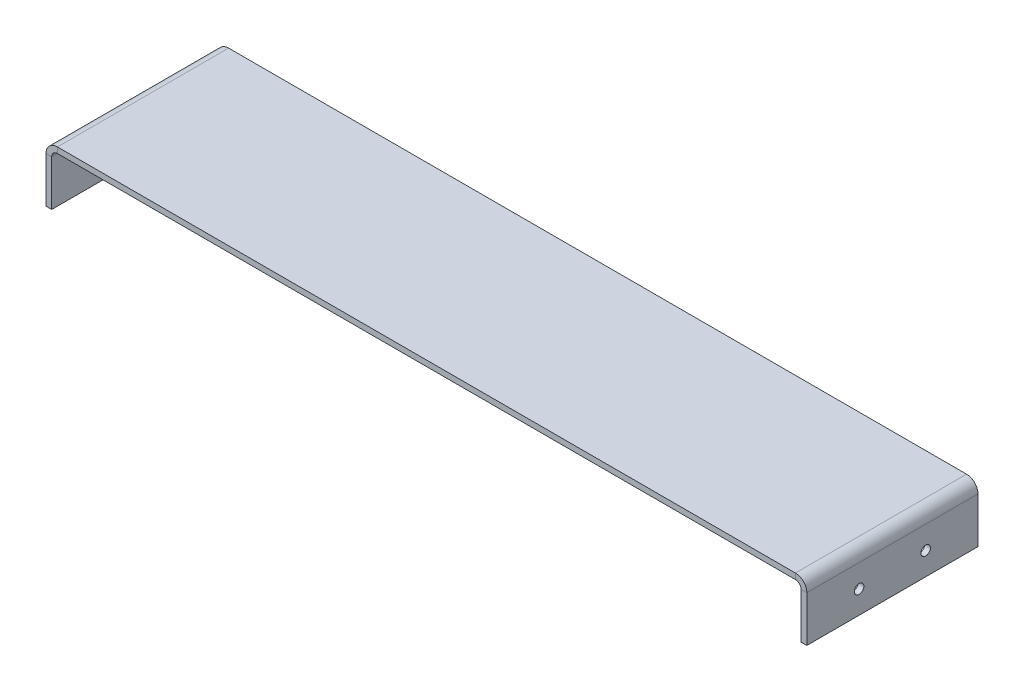
ISO-10303-21;
HEADER;
FILE_DESCRIPTION(('STEP AP214'),'2;1');
FILE_NAME('part.step','',(''),(''),'','','');
FILE_SCHEMA(('AUTOMOTIVE_DESIGN { 1 0 10303 214 1 1 1 1 }'));
ENDSEC;
DATA;
#1=APPLICATION_CONTEXT('core data for automotive mechanical design processes');
#2=APPLICATION_PROTOCOL_DEFINITION('international standard','automotive_design',2000,#1);
#3=PRODUCT_CONTEXT('',#1,'mechanical');
#4=PRODUCT('Part','Part','',(#3));
#5=PRODUCT_RELATED_PRODUCT_CATEGORY('part','',(#4));
#6=PRODUCT_DEFINITION_FORMATION('','',#4);
#7=PRODUCT_DEFINITION_CONTEXT('part definition',#1,'design');
#8=PRODUCT_DEFINITION('design','',#6,#7);
#9=PRODUCT_DEFINITION_SHAPE('','',#8);
#10=(LENGTH_UNIT() NAMED_UNIT(*) SI_UNIT(.MILLI.,.METRE.));
#11=(NAMED_UNIT(*) PLANE_ANGLE_UNIT() SI_UNIT($,.RADIAN.));
#12=(NAMED_UNIT(*) SI_UNIT($,.STERADIAN.) SOLID_ANGLE_UNIT());
#13=UNCERTAINTY_MEASURE_WITH_UNIT(LENGTH_MEASURE(1.E-05),#10,'distance_accuracy_value','');
#14=(GEOMETRIC_REPRESENTATION_CONTEXT(3) GLOBAL_UNCERTAINTY_ASSIGNED_CONTEXT((#13)) GLOBAL_UNIT_ASSIGNED_CONTEXT((#10,
#11,#12)) REPRESENTATION_CONTEXT('',''));
#15=CARTESIAN_POINT('',(0.,0.,0.));
#16=DIRECTION('',(0.,0.,1.));
#17=DIRECTION('',(1.,0.,0.));
#18=AXIS2_PLACEMENT_3D('',#15,#16,#17);
#19=CARTESIAN_POINT('',(0.,-3.,0.));
#20=DIRECTION('',(0.,1.,0.));
#21=DIRECTION('',(0.,0.,1.));
#22=AXIS2_PLACEMENT_3D('',#19,#20,#21);
#23=PLANE('',#22);
#24=DIRECTION('',(0.,0.,1.));
#25=VECTOR('',#24,1.);
#26=CARTESIAN_POINT('',(194.,-2.99999999999998,0.));
#27=LINE('',#26,#25);
#28=CARTESIAN_POINT('',(194.,-2.99999999999998,0.));
#29=VERTEX_POINT('',#28);
#30=CARTESIAN_POINT('',(194.,-2.99999999999998,-90.));
#31=VERTEX_POINT('',#30);
#32=EDGE_CURVE('E224',#29,#31,#27,.F.);
#33=ORIENTED_EDGE('',*,*,#32,.F.);
#34=DIRECTION('',(1.,0.,0.));
#35=VECTOR('',#34,1.);
#36=CARTESIAN_POINT('',(-200.,-3.,0.));
#37=LINE('',#36,#35);
#38=CARTESIAN_POINT('',(-194.,-3.00000000000001,0.));
#39=VERTEX_POINT('',#38);
#40=EDGE_CURVE('E88',#39,#29,#37,.T.);
#41=ORIENTED_EDGE('',*,*,#40,.F.);
#42=DIRECTION('',(0.,0.,-1.));
#43=VECTOR('',#42,1.);
#44=CARTESIAN_POINT('',(-194.,-3.00000000000001,-90.));
#45=LINE('',#44,#43);
#46=CARTESIAN_POINT('',(-194.,-3.00000000000001,-90.));
#47=VERTEX_POINT('',#46);
#48=EDGE_CURVE('E275',#47,#39,#45,.F.);
#49=ORIENTED_EDGE('',*,*,#48,.F.);
#50=DIRECTION('',(-1.,0.,0.));
#51=VECTOR('',#50,1.);
#52=CARTESIAN_POINT('',(-200.,-3.,-90.));
#53=LINE('',#52,#51);
#54=EDGE_CURVE('E13',#31,#47,#53,.T.);
#55=ORIENTED_EDGE('',*,*,#54,.F.);
#56=EDGE_LOOP('',(#33,#41,#49,#55));
#57=FACE_BOUND('',#56,.T.);
#58=ADVANCED_FACE('F79',(#57),#23,.F.);
#59=CARTESIAN_POINT('',(0.,0.,0.));
#60=DIRECTION('',(0.,1.,0.));
#61=DIRECTION('',(0.,0.,1.));
#62=AXIS2_PLACEMENT_3D('',#59,#60,#61);
#63=PLANE('',#62);
#64=DIRECTION('',(1.,0.,0.));
#65=VECTOR('',#64,1.);
#66=CARTESIAN_POINT('',(-200.,0.,0.));
#67=LINE('',#66,#65);
#68=CARTESIAN_POINT('',(-194.,0.,0.));
#69=VERTEX_POINT('',#68);
#70=CARTESIAN_POINT('',(194.,0.,0.));
#71=VERTEX_POINT('',#70);
#72=EDGE_CURVE('E281',#69,#71,#67,.T.);
#73=ORIENTED_EDGE('',*,*,#72,.T.);
#74=DIRECTION('',(0.,0.,1.));
#75=VECTOR('',#74,1.);
#76=CARTESIAN_POINT('',(194.,0.,0.));
#77=LINE('',#76,#75);
#78=CARTESIAN_POINT('',(194.,0.,-90.));
#79=VERTEX_POINT('',#78);
#80=EDGE_CURVE('E213',#71,#79,#77,.F.);
#81=ORIENTED_EDGE('',*,*,#80,.T.);
#82=DIRECTION('',(-1.,0.,0.));
#83=VECTOR('',#82,1.);
#84=CARTESIAN_POINT('',(-200.,0.,-90.));
#85=LINE('',#84,#83);
#86=CARTESIAN_POINT('',(-194.,0.,-90.));
#87=VERTEX_POINT('',#86);
#88=EDGE_CURVE('E285',#79,#87,#85,.T.);
#89=ORIENTED_EDGE('',*,*,#88,.T.);
#90=DIRECTION('',(0.,0.,-1.));
#91=VECTOR('',#90,1.);
#92=CARTESIAN_POINT('',(-194.,0.,-90.));
#93=LINE('',#92,#91);
#94=EDGE_CURVE('E264',#87,#69,#93,.F.);
#95=ORIENTED_EDGE('',*,*,#94,.T.);
#96=EDGE_LOOP('',(#73,#81,#89,#95));
#97=FACE_BOUND('',#96,.T.);
#98=ADVANCED_FACE('F332',(#97),#63,.T.);
#99=CARTESIAN_POINT('',(-200.,-3.,0.));
#100=DIRECTION('',(0.,0.,1.));
#101=DIRECTION('',(1.,0.,0.));
#102=AXIS2_PLACEMENT_3D('',#99,#100,#101);
#103=PLANE('',#102);
#104=ORIENTED_EDGE('',*,*,#40,.T.);
#105=DIRECTION('',(0.,1.,0.));
#106=VECTOR('',#105,1.);
#107=CARTESIAN_POINT('',(194.,-2.99999999999998,0.));
#108=LINE('',#107,#106);
#109=EDGE_CURVE('E218',#29,#71,#108,.T.);
#110=ORIENTED_EDGE('',*,*,#109,.T.);
#111=ORIENTED_EDGE('',*,*,#72,.F.);
#112=DIRECTION('',(0.,1.,0.));
#113=VECTOR('',#112,1.);
#114=CARTESIAN_POINT('',(-194.,-3.00000000000001,0.));
#115=LINE('',#114,#113);
#116=EDGE_CURVE('E279',#39,#69,#115,.T.);
#117=ORIENTED_EDGE('',*,*,#116,.F.);
#118=EDGE_LOOP('',(#104,#110,#111,#117));
#119=FACE_BOUND('',#118,.T.);
#120=ADVANCED_FACE('F81',(#119),#103,.T.);
#121=CARTESIAN_POINT('',(-200.,-3.,-90.));
#122=DIRECTION('',(0.,0.,-1.));
#123=DIRECTION('',(-1.,0.,0.));
#124=AXIS2_PLACEMENT_3D('',#121,#122,#123);
#125=PLANE('',#124);
#126=DIRECTION('',(0.,1.,0.));
#127=VECTOR('',#126,1.);
#128=CARTESIAN_POINT('',(194.,-2.99999999999998,-90.));
#129=LINE('',#128,#127);
#130=EDGE_CURVE('E229',#31,#79,#129,.T.);
#131=ORIENTED_EDGE('',*,*,#130,.F.);
#132=ORIENTED_EDGE('',*,*,#54,.T.);
#133=DIRECTION('',(0.,1.,0.));
#134=VECTOR('',#133,1.);
#135=CARTESIAN_POINT('',(-194.,-3.00000000000001,-90.));
#136=LINE('',#135,#134);
#137=EDGE_CURVE('E269',#47,#87,#136,.T.);
#138=ORIENTED_EDGE('',*,*,#137,.T.);
#139=ORIENTED_EDGE('',*,*,#88,.F.);
#140=EDGE_LOOP('',(#131,#132,#138,#139));
#141=FACE_BOUND('',#140,.T.);
#142=ADVANCED_FACE('F387',(#141),#125,.T.);
#143=CARTESIAN_POINT('',(-194.,-6.00000000000002,0.));
#144=DIRECTION('',(0.,0.,1.));
#145=DIRECTION('',(1.,0.,0.));
#146=AXIS2_PLACEMENT_3D('',#143,#144,#145);
#147=PLANE('',#146);
#148=DIRECTION('',(1.,0.,0.));
#149=VECTOR('',#148,1.);
#150=CARTESIAN_POINT('',(-200.,-6.,0.));
#151=LINE('',#150,#149);
#152=CARTESIAN_POINT('',(-197.,-6.00000000000001,0.));
#153=VERTEX_POINT('',#152);
#154=CARTESIAN_POINT('',(-200.,-6.,0.));
#155=VERTEX_POINT('',#154);
#156=EDGE_CURVE('E231',#153,#155,#151,.F.);
#157=ORIENTED_EDGE('',*,*,#156,.F.);
#158=CARTESIAN_POINT('',(-194.,-6.00000000000002,0.));
#159=DIRECTION('',(0.,0.,-1.));
#160=DIRECTION('',(-1.,0.,0.));
#161=AXIS2_PLACEMENT_3D('',#158,#159,#160);
#162=CIRCLE('',#161,3.);
#163=EDGE_CURVE('E272',#39,#153,#162,.F.);
#164=ORIENTED_EDGE('',*,*,#163,.F.);
#165=ORIENTED_EDGE('',*,*,#116,.T.);
#166=CARTESIAN_POINT('',(-194.,-6.00000000000002,0.));
#167=DIRECTION('',(0.,0.,-1.));
#168=DIRECTION('',(-1.,0.,0.));
#169=AXIS2_PLACEMENT_3D('',#166,#167,#168);
#170=CIRCLE('',#169,6.);
#171=EDGE_CURVE('E96',#69,#155,#170,.F.);
#172=ORIENTED_EDGE('',*,*,#171,.T.);
#173=EDGE_LOOP('',(#157,#164,#165,#172));
#174=FACE_BOUND('',#173,.T.);
#175=ADVANCED_FACE('F358',(#174),#147,.T.);
#176=CARTESIAN_POINT('',(-194.,-6.00000000000002,-90.));
#177=DIRECTION('',(0.,0.,1.));
#178=DIRECTION('',(1.,0.,0.));
#179=AXIS2_PLACEMENT_3D('',#176,#177,#178);
#180=PLANE('',#179);
#181=CARTESIAN_POINT('',(-194.,-6.00000000000002,-90.));
#182=DIRECTION('',(0.,0.,-1.));
#183=DIRECTION('',(-1.,0.,0.));
#184=AXIS2_PLACEMENT_3D('',#181,#182,#183);
#185=CIRCLE('',#184,3.);
#186=CARTESIAN_POINT('',(-197.,-6.00000000000001,-90.));
#187=VERTEX_POINT('',#186);
#188=EDGE_CURVE('E237',#187,#47,#185,.T.);
#189=ORIENTED_EDGE('',*,*,#188,.F.);
#190=DIRECTION('',(1.,0.,0.));
#191=VECTOR('',#190,1.);
#192=CARTESIAN_POINT('',(-197.,-6.00000000000001,-90.));
#193=LINE('',#192,#191);
#194=CARTESIAN_POINT('',(-200.,-6.,-90.));
#195=VERTEX_POINT('',#194);
#196=EDGE_CURVE('E257',#187,#195,#193,.F.);
#197=ORIENTED_EDGE('',*,*,#196,.T.);
#198=CARTESIAN_POINT('',(-194.,-6.00000000000002,-90.));
#199=DIRECTION('',(0.,0.,-1.));
#200=DIRECTION('',(-1.,0.,0.));
#201=AXIS2_PLACEMENT_3D('',#198,#199,#200);
#202=CIRCLE('',#201,6.);
#203=EDGE_CURVE('E267',#195,#87,#202,.T.);
#204=ORIENTED_EDGE('',*,*,#203,.T.);
#205=ORIENTED_EDGE('',*,*,#137,.F.);
#206=EDGE_LOOP('',(#189,#197,#204,#205));
#207=FACE_BOUND('',#206,.T.);
#208=ADVANCED_FACE('F337',(#207),#180,.F.);
#209=CARTESIAN_POINT('',(-194.,-6.00000000000002,-90.));
#210=DIRECTION('',(0.,0.,-1.));
#211=DIRECTION('',(-1.,0.,0.));
#212=AXIS2_PLACEMENT_3D('',#209,#210,#211);
#213=CYLINDRICAL_SURFACE('',#212,6.);
#214=ORIENTED_EDGE('',*,*,#94,.F.);
#215=ORIENTED_EDGE('',*,*,#203,.F.);
#216=DIRECTION('',(0.,0.,-1.));
#217=VECTOR('',#216,1.);
#218=CARTESIAN_POINT('',(-200.,-6.,0.));
#219=LINE('',#218,#217);
#220=EDGE_CURVE('E255',#195,#155,#219,.F.);
#221=ORIENTED_EDGE('',*,*,#220,.T.);
#222=ORIENTED_EDGE('',*,*,#171,.F.);
#223=EDGE_LOOP('',(#214,#215,#221,#222));
#224=FACE_BOUND('',#223,.T.);
#225=ADVANCED_FACE('F334',(#224),#213,.T.);
#226=CARTESIAN_POINT('',(-194.,-6.00000000000002,-90.));
#227=DIRECTION('',(0.,0.,-1.));
#228=DIRECTION('',(-1.,0.,0.));
#229=AXIS2_PLACEMENT_3D('',#226,#227,#228);
#230=CYLINDRICAL_SURFACE('',#229,3.);
#231=ORIENTED_EDGE('',*,*,#48,.T.);
#232=ORIENTED_EDGE('',*,*,#163,.T.);
#233=DIRECTION('',(0.,0.,-1.));
#234=VECTOR('',#233,1.);
#235=CARTESIAN_POINT('',(-197.,-6.00000000000001,0.));
#236=LINE('',#235,#234);
#237=EDGE_CURVE('E260',#153,#187,#236,.T.);
#238=ORIENTED_EDGE('',*,*,#237,.T.);
#239=ORIENTED_EDGE('',*,*,#188,.T.);
#240=EDGE_LOOP('',(#231,#232,#238,#239));
#241=FACE_BOUND('',#240,.T.);
#242=ADVANCED_FACE('F361',(#241),#230,.F.);
#243=CARTESIAN_POINT('',(-200.,-30.,-90.));
#244=DIRECTION('',(0.,0.,1.));
#245=DIRECTION('',(1.,0.,0.));
#246=AXIS2_PLACEMENT_3D('',#243,#244,#245);
#247=PLANE('',#246);
#248=ORIENTED_EDGE('',*,*,#196,.F.);
#249=DIRECTION('',(0.,1.,0.));
#250=VECTOR('',#249,1.);
#251=CARTESIAN_POINT('',(-197.,-30.,-90.));
#252=LINE('',#251,#250);
#253=CARTESIAN_POINT('',(-197.,-30.,-90.));
#254=VERTEX_POINT('',#253);
#255=EDGE_CURVE('E253',#187,#254,#252,.F.);
#256=ORIENTED_EDGE('',*,*,#255,.T.);
#257=DIRECTION('',(1.,0.,0.));
#258=VECTOR('',#257,1.);
#259=CARTESIAN_POINT('',(-200.,-30.,-90.));
#260=LINE('',#259,#258);
#261=CARTESIAN_POINT('',(-200.,-30.,-90.));
#262=VERTEX_POINT('',#261);
#263=EDGE_CURVE('E234',#262,#254,#260,.T.);
#264=ORIENTED_EDGE('',*,*,#263,.F.);
#265=DIRECTION('',(0.,-1.,0.));
#266=VECTOR('',#265,1.);
#267=CARTESIAN_POINT('',(-200.,6.27265013252727E-13,-90.));
#268=LINE('',#267,#266);
#269=EDGE_CURVE('E246',#195,#262,#268,.T.);
#270=ORIENTED_EDGE('',*,*,#269,.F.);
#271=EDGE_LOOP('',(#248,#256,#264,#270));
#272=FACE_BOUND('',#271,.T.);
#273=ADVANCED_FACE('F348',(#272),#247,.F.);
#274=CARTESIAN_POINT('',(-200.,-2.99999999999999,0.));
#275=DIRECTION('',(0.,0.,-1.));
#276=DIRECTION('',(0.,1.,0.));
#277=AXIS2_PLACEMENT_3D('',#274,#275,#276);
#278=PLANE('',#277);
#279=ORIENTED_EDGE('',*,*,#156,.T.);
#280=DIRECTION('',(0.,1.,0.));
#281=VECTOR('',#280,1.);
#282=CARTESIAN_POINT('',(-200.,6.27265013252727E-13,0.));
#283=LINE('',#282,#281);
#284=CARTESIAN_POINT('',(-200.,-30.,-1.09617417266271E-13));
#285=VERTEX_POINT('',#284);
#286=EDGE_CURVE('E241',#285,#155,#283,.T.);
#287=ORIENTED_EDGE('',*,*,#286,.F.);
#288=DIRECTION('',(1.,0.,0.));
#289=VECTOR('',#288,1.);
#290=CARTESIAN_POINT('',(-200.,-30.,-1.09617417266271E-13));
#291=LINE('',#290,#289);
#292=CARTESIAN_POINT('',(-197.,-30.,-1.09617417266271E-13));
#293=VERTEX_POINT('',#292);
#294=EDGE_CURVE('E238',#285,#293,#291,.T.);
#295=ORIENTED_EDGE('',*,*,#294,.T.);
#296=DIRECTION('',(0.,-1.,0.));
#297=VECTOR('',#296,1.);
#298=CARTESIAN_POINT('',(-197.,-3.,0.));
#299=LINE('',#298,#297);
#300=EDGE_CURVE('E248',#293,#153,#299,.F.);
#301=ORIENTED_EDGE('',*,*,#300,.T.);
#302=EDGE_LOOP('',(#279,#287,#295,#301));
#303=FACE_BOUND('',#302,.T.);
#304=ADVANCED_FACE('F355',(#303),#278,.F.);
#305=CARTESIAN_POINT('',(-200.,6.27265013252727E-13,0.));
#306=DIRECTION('',(1.,0.,0.));
#307=DIRECTION('',(0.,1.,0.));
#308=AXIS2_PLACEMENT_3D('',#305,#306,#307);
#309=PLANE('',#308);
#310=CARTESIAN_POINT('',(-200.,-18.0000000000012,-62.4999999999997));
#311=DIRECTION('',(1.,0.,0.));
#312=DIRECTION('',(0.,1.,0.));
#313=AXIS2_PLACEMENT_3D('',#310,#311,#312);
#314=CIRCLE('',#313,2.5);
#315=CARTESIAN_POINT('',(-200.,-15.5000000000012,-62.4999999999997));
#316=VERTEX_POINT('',#315);
#317=EDGE_CURVE('E293',#316,#316,#314,.T.);
#318=ORIENTED_EDGE('',*,*,#317,.T.);
#319=EDGE_LOOP('',(#318));
#320=FACE_BOUND('',#319,.T.);
#321=CARTESIAN_POINT('',(-200.,-18.0000000000012,-27.4999999999997));
#322=DIRECTION('',(1.,0.,0.));
#323=DIRECTION('',(0.,-1.,0.));
#324=AXIS2_PLACEMENT_3D('',#321,#322,#323);
#325=CIRCLE('',#324,2.50000000000001);
#326=CARTESIAN_POINT('',(-200.,-20.5000000000012,-27.4999999999997));
#327=VERTEX_POINT('',#326);
#328=EDGE_CURVE('E304',#327,#327,#325,.T.);
#329=ORIENTED_EDGE('',*,*,#328,.T.);
#330=EDGE_LOOP('',(#329));
#331=FACE_BOUND('',#330,.T.);
#332=ORIENTED_EDGE('',*,*,#220,.F.);
#333=ORIENTED_EDGE('',*,*,#269,.T.);
#334=DIRECTION('',(0.,0.,1.));
#335=VECTOR('',#334,1.);
#336=CARTESIAN_POINT('',(-200.,-30.,0.));
#337=LINE('',#336,#335);
#338=EDGE_CURVE('E244',#262,#285,#337,.T.);
#339=ORIENTED_EDGE('',*,*,#338,.T.);
#340=ORIENTED_EDGE('',*,*,#286,.T.);
#341=EDGE_LOOP('',(#332,#333,#339,#340));
#342=FACE_BOUND('',#341,.T.);
#343=ADVANCED_FACE('F344',(#320,#331,#342),#309,.F.);
#344=CARTESIAN_POINT('',(-197.,6.16790569236198E-13,0.));
#345=DIRECTION('',(1.,0.,0.));
#346=DIRECTION('',(0.,1.,0.));
#347=AXIS2_PLACEMENT_3D('',#344,#345,#346);
#348=PLANE('',#347);
#349=CARTESIAN_POINT('',(-197.,-18.0000000000012,-62.4999999999997));
#350=DIRECTION('',(1.,0.,0.));
#351=DIRECTION('',(0.,1.,0.));
#352=AXIS2_PLACEMENT_3D('',#349,#350,#351);
#353=CIRCLE('',#352,2.5);
#354=CARTESIAN_POINT('',(-197.,-15.5000000000012,-62.4999999999997));
#355=VERTEX_POINT('',#354);
#356=EDGE_CURVE('E212',#355,#355,#353,.T.);
#357=ORIENTED_EDGE('',*,*,#356,.F.);
#358=EDGE_LOOP('',(#357));
#359=FACE_BOUND('',#358,.T.);
#360=CARTESIAN_POINT('',(-197.,-18.0000000000012,-27.4999999999997));
#361=DIRECTION('',(1.,0.,0.));
#362=DIRECTION('',(0.,1.,0.));
#363=AXIS2_PLACEMENT_3D('',#360,#361,#362);
#364=CIRCLE('',#363,2.50000000000001);
#365=CARTESIAN_POINT('',(-197.,-15.5000000000012,-27.4999999999997));
#366=VERTEX_POINT('',#365);
#367=EDGE_CURVE('E292',#366,#366,#364,.T.);
#368=ORIENTED_EDGE('',*,*,#367,.F.);
#369=EDGE_LOOP('',(#368));
#370=FACE_BOUND('',#369,.T.);
#371=ORIENTED_EDGE('',*,*,#255,.F.);
#372=ORIENTED_EDGE('',*,*,#237,.F.);
#373=ORIENTED_EDGE('',*,*,#300,.F.);
#374=DIRECTION('',(0.,0.,-1.));
#375=VECTOR('',#374,1.);
#376=CARTESIAN_POINT('',(-197.,-30.,-1.09617417266271E-13));
#377=LINE('',#376,#375);
#378=EDGE_CURVE('E251',#254,#293,#377,.F.);
#379=ORIENTED_EDGE('',*,*,#378,.F.);
#380=EDGE_LOOP('',(#371,#372,#373,#379));
#381=FACE_BOUND('',#380,.T.);
#382=ADVANCED_FACE('F364',(#359,#370,#381),#348,.T.);
#383=CARTESIAN_POINT('',(-200.,-30.,-1.09617417266271E-13));
#384=DIRECTION('',(0.,1.,0.));
#385=DIRECTION('',(-1.,0.,0.));
#386=AXIS2_PLACEMENT_3D('',#383,#384,#385);
#387=PLANE('',#386);
#388=ORIENTED_EDGE('',*,*,#378,.T.);
#389=ORIENTED_EDGE('',*,*,#294,.F.);
#390=ORIENTED_EDGE('',*,*,#338,.F.);
#391=ORIENTED_EDGE('',*,*,#263,.T.);
#392=EDGE_LOOP('',(#388,#389,#390,#391));
#393=FACE_BOUND('',#392,.T.);
#394=ADVANCED_FACE('F351',(#393),#387,.F.);
#395=CARTESIAN_POINT('',(194.,-6.00000000000002,-90.));
#396=DIRECTION('',(0.,0.,-1.));
#397=DIRECTION('',(-1.,0.,0.));
#398=AXIS2_PLACEMENT_3D('',#395,#396,#397);
#399=PLANE('',#398);
#400=DIRECTION('',(-1.,0.,0.));
#401=VECTOR('',#400,1.);
#402=CARTESIAN_POINT('',(200.,-6.,-90.));
#403=LINE('',#402,#401);
#404=CARTESIAN_POINT('',(197.,-6.00000000000001,-90.));
#405=VERTEX_POINT('',#404);
#406=CARTESIAN_POINT('',(200.,-6.,-90.));
#407=VERTEX_POINT('',#406);
#408=EDGE_CURVE('E194',#405,#407,#403,.F.);
#409=ORIENTED_EDGE('',*,*,#408,.F.);
#410=CARTESIAN_POINT('',(194.,-6.00000000000002,-90.));
#411=DIRECTION('',(0.,0.,1.));
#412=DIRECTION('',(1.,0.,0.));
#413=AXIS2_PLACEMENT_3D('',#410,#411,#412);
#414=CIRCLE('',#413,3.00000000000003);
#415=EDGE_CURVE('E221',#31,#405,#414,.F.);
#416=ORIENTED_EDGE('',*,*,#415,.F.);
#417=ORIENTED_EDGE('',*,*,#130,.T.);
#418=CARTESIAN_POINT('',(194.,-6.00000000000002,-90.));
#419=DIRECTION('',(0.,0.,1.));
#420=DIRECTION('',(1.,0.,0.));
#421=AXIS2_PLACEMENT_3D('',#418,#419,#420);
#422=CIRCLE('',#421,6.00000000000003);
#423=EDGE_CURVE('E104',#79,#407,#422,.F.);
#424=ORIENTED_EDGE('',*,*,#423,.T.);
#425=EDGE_LOOP('',(#409,#416,#417,#424));
#426=FACE_BOUND('',#425,.T.);
#427=ADVANCED_FACE('F372',(#426),#399,.T.);
#428=CARTESIAN_POINT('',(194.,-6.00000000000002,0.));
#429=DIRECTION('',(0.,0.,-1.));
#430=DIRECTION('',(-1.,0.,0.));
#431=AXIS2_PLACEMENT_3D('',#428,#429,#430);
#432=PLANE('',#431);
#433=CARTESIAN_POINT('',(194.,-6.00000000000002,0.));
#434=DIRECTION('',(0.,0.,1.));
#435=DIRECTION('',(1.,0.,0.));
#436=AXIS2_PLACEMENT_3D('',#433,#434,#435);
#437=CIRCLE('',#436,3.00000000000003);
#438=CARTESIAN_POINT('',(197.,-6.00000000000001,0.));
#439=VERTEX_POINT('',#438);
#440=EDGE_CURVE('E226',#439,#29,#437,.T.);
#441=ORIENTED_EDGE('',*,*,#440,.F.);
#442=DIRECTION('',(-1.,0.,0.));
#443=VECTOR('',#442,1.);
#444=CARTESIAN_POINT('',(197.,-6.00000000000001,0.));
#445=LINE('',#444,#443);
#446=CARTESIAN_POINT('',(200.,-6.,0.));
#447=VERTEX_POINT('',#446);
#448=EDGE_CURVE('E206',#439,#447,#445,.F.);
#449=ORIENTED_EDGE('',*,*,#448,.T.);
#450=CARTESIAN_POINT('',(194.,-6.00000000000002,0.));
#451=DIRECTION('',(0.,0.,1.));
#452=DIRECTION('',(1.,0.,0.));
#453=AXIS2_PLACEMENT_3D('',#450,#451,#452);
#454=CIRCLE('',#453,6.00000000000003);
#455=EDGE_CURVE('E216',#447,#71,#454,.T.);
#456=ORIENTED_EDGE('',*,*,#455,.T.);
#457=ORIENTED_EDGE('',*,*,#109,.F.);
#458=EDGE_LOOP('',(#441,#449,#456,#457));
#459=FACE_BOUND('',#458,.T.);
#460=ADVANCED_FACE('F326',(#459),#432,.F.);
#461=CARTESIAN_POINT('',(194.,-6.00000000000002,0.));
#462=DIRECTION('',(0.,0.,1.));
#463=DIRECTION('',(1.,0.,0.));
#464=AXIS2_PLACEMENT_3D('',#461,#462,#463);
#465=CYLINDRICAL_SURFACE('',#464,6.00000000000003);
#466=ORIENTED_EDGE('',*,*,#80,.F.);
#467=ORIENTED_EDGE('',*,*,#455,.F.);
#468=DIRECTION('',(0.,0.,1.));
#469=VECTOR('',#468,1.);
#470=CARTESIAN_POINT('',(200.,-6.,-90.));
#471=LINE('',#470,#469);
#472=EDGE_CURVE('E204',#447,#407,#471,.F.);
#473=ORIENTED_EDGE('',*,*,#472,.T.);
#474=ORIENTED_EDGE('',*,*,#423,.F.);
#475=EDGE_LOOP('',(#466,#467,#473,#474));
#476=FACE_BOUND('',#475,.T.);
#477=ADVANCED_FACE('F402',(#476),#465,.T.);
#478=CARTESIAN_POINT('',(194.,-6.00000000000002,0.));
#479=DIRECTION('',(0.,0.,1.));
#480=DIRECTION('',(1.,0.,0.));
#481=AXIS2_PLACEMENT_3D('',#478,#479,#480);
#482=CYLINDRICAL_SURFACE('',#481,3.00000000000003);
#483=ORIENTED_EDGE('',*,*,#32,.T.);
#484=ORIENTED_EDGE('',*,*,#415,.T.);
#485=DIRECTION('',(0.,0.,1.));
#486=VECTOR('',#485,1.);
#487=CARTESIAN_POINT('',(197.,-6.00000000000001,-90.));
#488=LINE('',#487,#486);
#489=EDGE_CURVE('E209',#405,#439,#488,.T.);
#490=ORIENTED_EDGE('',*,*,#489,.T.);
#491=ORIENTED_EDGE('',*,*,#440,.T.);
#492=EDGE_LOOP('',(#483,#484,#490,#491));
#493=FACE_BOUND('',#492,.T.);
#494=ADVANCED_FACE('F322',(#493),#482,.F.);
#495=CARTESIAN_POINT('',(200.,-30.,1.77635683940025E-13));
#496=DIRECTION('',(0.,0.,-1.));
#497=DIRECTION('',(0.,1.,0.));
#498=AXIS2_PLACEMENT_3D('',#495,#496,#497);
#499=PLANE('',#498);
#500=ORIENTED_EDGE('',*,*,#448,.F.);
#501=DIRECTION('',(0.,1.,0.));
#502=VECTOR('',#501,1.);
#503=CARTESIAN_POINT('',(197.,-30.,1.75785312232317E-13));
#504=LINE('',#503,#502);
#505=CARTESIAN_POINT('',(197.,-30.,1.78329573330416E-13));
#506=VERTEX_POINT('',#505);
#507=EDGE_CURVE('E202',#439,#506,#504,.F.);
#508=ORIENTED_EDGE('',*,*,#507,.T.);
#509=DIRECTION('',(-1.,0.,0.));
#510=VECTOR('',#509,1.);
#511=CARTESIAN_POINT('',(200.,-30.,1.80411241501588E-13));
#512=LINE('',#511,#510);
#513=CARTESIAN_POINT('',(200.,-30.,1.79023462720807E-13));
#514=VERTEX_POINT('',#513);
#515=EDGE_CURVE('E190',#514,#506,#512,.T.);
#516=ORIENTED_EDGE('',*,*,#515,.F.);
#517=DIRECTION('',(0.,-1.,0.));
#518=VECTOR('',#517,1.);
#519=CARTESIAN_POINT('',(200.,6.27265013252727E-13,0.));
#520=LINE('',#519,#518);
#521=EDGE_CURVE('E177',#447,#514,#520,.T.);
#522=ORIENTED_EDGE('',*,*,#521,.F.);
#523=EDGE_LOOP('',(#500,#508,#516,#522));
#524=FACE_BOUND('',#523,.T.);
#525=ADVANCED_FACE('F315',(#524),#499,.F.);
#526=CARTESIAN_POINT('',(200.,-2.99999999999999,-90.));
#527=DIRECTION('',(0.,0.,1.));
#528=DIRECTION('',(1.,0.,0.));
#529=AXIS2_PLACEMENT_3D('',#526,#527,#528);
#530=PLANE('',#529);
#531=ORIENTED_EDGE('',*,*,#408,.T.);
#532=DIRECTION('',(0.,1.,0.));
#533=VECTOR('',#532,1.);
#534=CARTESIAN_POINT('',(200.,6.27265013252728E-13,-90.));
#535=LINE('',#534,#533);
#536=CARTESIAN_POINT('',(200.,-30.,-90.));
#537=VERTEX_POINT('',#536);
#538=EDGE_CURVE('E175',#537,#407,#535,.T.);
#539=ORIENTED_EDGE('',*,*,#538,.F.);
#540=DIRECTION('',(-1.,0.,0.));
#541=VECTOR('',#540,1.);
#542=CARTESIAN_POINT('',(200.,-30.,-90.));
#543=LINE('',#542,#541);
#544=CARTESIAN_POINT('',(197.,-30.,-90.));
#545=VERTEX_POINT('',#544);
#546=EDGE_CURVE('E183',#537,#545,#543,.T.);
#547=ORIENTED_EDGE('',*,*,#546,.T.);
#548=DIRECTION('',(0.,-1.,0.));
#549=VECTOR('',#548,1.);
#550=CARTESIAN_POINT('',(197.,-3.,-90.));
#551=LINE('',#550,#549);
#552=EDGE_CURVE('E199',#545,#405,#551,.F.);
#553=ORIENTED_EDGE('',*,*,#552,.T.);
#554=EDGE_LOOP('',(#531,#539,#547,#553));
#555=FACE_BOUND('',#554,.T.);
#556=ADVANCED_FACE('F193',(#555),#530,.F.);
#557=CARTESIAN_POINT('',(200.,6.27265013252728E-13,1.2335811384724E-13));
#558=DIRECTION('',(-1.,0.,0.));
#559=DIRECTION('',(0.,-1.,0.));
#560=AXIS2_PLACEMENT_3D('',#557,#558,#559);
#561=PLANE('',#560);
#562=CARTESIAN_POINT('',(200.,-18.,-62.4999999999999));
#563=DIRECTION('',(1.,0.,0.));
#564=DIRECTION('',(0.,1.,0.));
#565=AXIS2_PLACEMENT_3D('',#562,#563,#564);
#566=CIRCLE('',#565,2.5);
#567=CARTESIAN_POINT('',(200.,-15.5,-62.4999999999999));
#568=VERTEX_POINT('',#567);
#569=EDGE_CURVE('E299',#568,#568,#566,.T.);
#570=ORIENTED_EDGE('',*,*,#569,.F.);
#571=EDGE_LOOP('',(#570));
#572=FACE_BOUND('',#571,.T.);
#573=CARTESIAN_POINT('',(200.,-18.,-27.4999999999999));
#574=DIRECTION('',(1.,0.,0.));
#575=DIRECTION('',(0.,-1.,0.));
#576=AXIS2_PLACEMENT_3D('',#573,#574,#575);
#577=CIRCLE('',#576,2.50000000000001);
#578=CARTESIAN_POINT('',(200.,-20.5,-27.4999999999999));
#579=VERTEX_POINT('',#578);
#580=EDGE_CURVE('E309',#579,#579,#577,.T.);
#581=ORIENTED_EDGE('',*,*,#580,.F.);
#582=EDGE_LOOP('',(#581));
#583=FACE_BOUND('',#582,.T.);
#584=ORIENTED_EDGE('',*,*,#472,.F.);
#585=ORIENTED_EDGE('',*,*,#521,.T.);
#586=DIRECTION('',(0.,0.,-1.));
#587=VECTOR('',#586,1.);
#588=CARTESIAN_POINT('',(200.,-30.,1.2335811384724E-13));
#589=LINE('',#588,#587);
#590=EDGE_CURVE('E170',#514,#537,#589,.T.);
#591=ORIENTED_EDGE('',*,*,#590,.T.);
#592=ORIENTED_EDGE('',*,*,#538,.T.);
#593=EDGE_LOOP('',(#584,#585,#591,#592));
#594=FACE_BOUND('',#593,.T.);
#595=ADVANCED_FACE('F173',(#572,#583,#594),#561,.F.);
#596=CARTESIAN_POINT('',(197.,6.16790569236198E-13,1.21507742139531E-13));
#597=DIRECTION('',(-1.,0.,0.));
#598=DIRECTION('',(0.,-1.,0.));
#599=AXIS2_PLACEMENT_3D('',#596,#597,#598);
#600=PLANE('',#599);
#601=CARTESIAN_POINT('',(197.,-18.,-62.4999999999999));
#602=DIRECTION('',(-1.,0.,0.));
#603=DIRECTION('',(0.,-1.,0.));
#604=AXIS2_PLACEMENT_3D('',#601,#602,#603);
#605=CIRCLE('',#604,2.5);
#606=CARTESIAN_POINT('',(197.,-20.5,-62.4999999999999));
#607=VERTEX_POINT('',#606);
#608=EDGE_CURVE('E83',#607,#607,#605,.T.);
#609=ORIENTED_EDGE('',*,*,#608,.F.);
#610=EDGE_LOOP('',(#609));
#611=FACE_BOUND('',#610,.T.);
#612=CARTESIAN_POINT('',(197.,-18.,-27.4999999999999));
#613=DIRECTION('',(-1.,0.,0.));
#614=DIRECTION('',(0.,-1.,0.));
#615=AXIS2_PLACEMENT_3D('',#612,#613,#614);
#616=CIRCLE('',#615,2.50000000000001);
#617=CARTESIAN_POINT('',(197.,-20.5,-27.4999999999999));
#618=VERTEX_POINT('',#617);
#619=EDGE_CURVE('E290',#618,#618,#616,.T.);
#620=ORIENTED_EDGE('',*,*,#619,.F.);
#621=EDGE_LOOP('',(#620));
#622=FACE_BOUND('',#621,.T.);
#623=ORIENTED_EDGE('',*,*,#507,.F.);
#624=ORIENTED_EDGE('',*,*,#489,.F.);
#625=ORIENTED_EDGE('',*,*,#552,.F.);
#626=DIRECTION('',(0.,0.,1.));
#627=VECTOR('',#626,1.);
#628=CARTESIAN_POINT('',(197.,-30.,-90.));
#629=LINE('',#628,#627);
#630=EDGE_CURVE('E186',#506,#545,#629,.F.);
#631=ORIENTED_EDGE('',*,*,#630,.F.);
#632=EDGE_LOOP('',(#623,#624,#625,#631));
#633=FACE_BOUND('',#632,.T.);
#634=ADVANCED_FACE('F319',(#611,#622,#633),#600,.T.);
#635=CARTESIAN_POINT('',(200.,-30.,-90.));
#636=DIRECTION('',(0.,1.,0.));
#637=DIRECTION('',(-1.,0.,0.));
#638=AXIS2_PLACEMENT_3D('',#635,#636,#637);
#639=PLANE('',#638);
#640=ORIENTED_EDGE('',*,*,#630,.T.);
#641=ORIENTED_EDGE('',*,*,#546,.F.);
#642=ORIENTED_EDGE('',*,*,#590,.F.);
#643=ORIENTED_EDGE('',*,*,#515,.T.);
#644=EDGE_LOOP('',(#640,#641,#642,#643));
#645=FACE_BOUND('',#644,.T.);
#646=ADVANCED_FACE('F184',(#645),#639,.F.);
#647=CARTESIAN_POINT('',(-200.,-18.0000000000012,-27.4999999999997));
#648=DIRECTION('',(1.,0.,0.));
#649=DIRECTION('',(0.,1.,0.));
#650=AXIS2_PLACEMENT_3D('',#647,#648,#649);
#651=CYLINDRICAL_SURFACE('',#650,2.50000000000001);
#652=ORIENTED_EDGE('',*,*,#619,.T.);
#653=EDGE_LOOP('',(#652));
#654=FACE_BOUND('',#653,.T.);
#655=ORIENTED_EDGE('',*,*,#580,.T.);
#656=EDGE_LOOP('',(#655));
#657=FACE_BOUND('',#656,.T.);
#658=ADVANCED_FACE('F413',(#654,#657),#651,.F.);
#659=CARTESIAN_POINT('',(-200.,-18.0000000000012,-62.4999999999997));
#660=DIRECTION('',(1.,0.,0.));
#661=DIRECTION('',(0.,1.,0.));
#662=AXIS2_PLACEMENT_3D('',#659,#660,#661);
#663=CYLINDRICAL_SURFACE('',#662,2.5);
#664=ORIENTED_EDGE('',*,*,#608,.T.);
#665=EDGE_LOOP('',(#664));
#666=FACE_BOUND('',#665,.T.);
#667=ORIENTED_EDGE('',*,*,#569,.T.);
#668=EDGE_LOOP('',(#667));
#669=FACE_BOUND('',#668,.T.);
#670=ADVANCED_FACE('F424',(#666,#669),#663,.F.);
#671=ORIENTED_EDGE('',*,*,#367,.T.);
#672=EDGE_LOOP('',(#671));
#673=FACE_BOUND('',#672,.T.);
#674=ORIENTED_EDGE('',*,*,#328,.F.);
#675=EDGE_LOOP('',(#674));
#676=FACE_BOUND('',#675,.T.);
#677=ADVANCED_FACE('F425',(#673,#676),#651,.F.);
#678=ORIENTED_EDGE('',*,*,#356,.T.);
#679=EDGE_LOOP('',(#678));
#680=FACE_BOUND('',#679,.T.);
#681=ORIENTED_EDGE('',*,*,#317,.F.);
#682=EDGE_LOOP('',(#681));
#683=FACE_BOUND('',#682,.T.);
#684=ADVANCED_FACE('F428',(#680,#683),#663,.F.);
#685=CLOSED_SHELL('',(#58,#98,#120,#142,#175,#208,#225,#242,#273,#304,#343,#382,#394,#427,#460,
#477,#494,#525,#556,#595,#634,#646,#658,#670,#677,#684));
#686=MANIFOLD_SOLID_BREP('B2',#685);
#687=ADVANCED_BREP_SHAPE_REPRESENTATION('',(#18,#686),#14);
#688=SHAPE_DEFINITION_REPRESENTATION(#9,#687);
ENDSEC;
END-ISO-10303-21;
